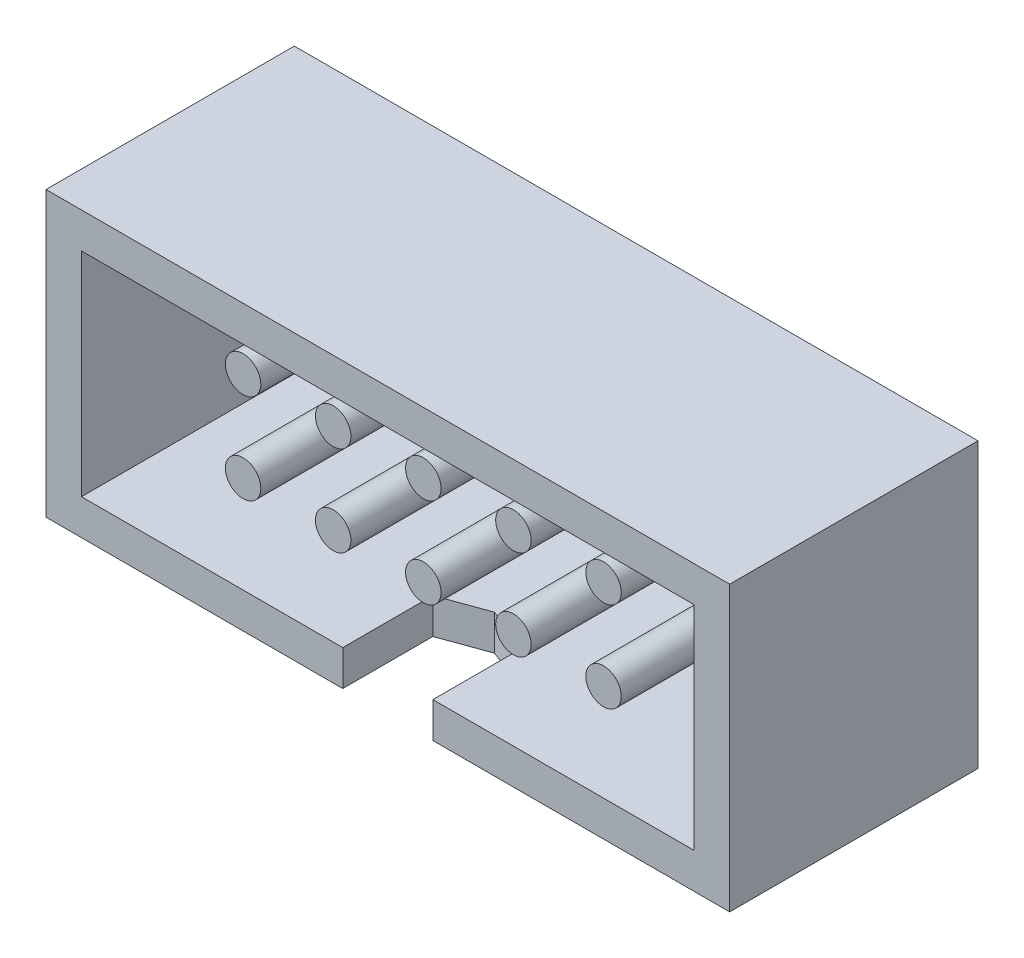
ISO-10303-21;
HEADER;
FILE_DESCRIPTION(('STEP AP214'),'2;1');
FILE_NAME('part.step','',(''),(''),'','','');
FILE_SCHEMA(('AUTOMOTIVE_DESIGN { 1 0 10303 214 1 1 1 1 }'));
ENDSEC;
DATA;
#1=APPLICATION_CONTEXT('core data for automotive mechanical design processes');
#2=APPLICATION_PROTOCOL_DEFINITION('international standard','automotive_design',2000,#1);
#3=PRODUCT_CONTEXT('',#1,'mechanical');
#4=PRODUCT('Part','Part','',(#3));
#5=PRODUCT_RELATED_PRODUCT_CATEGORY('part','',(#4));
#6=PRODUCT_DEFINITION_FORMATION('','',#4);
#7=PRODUCT_DEFINITION_CONTEXT('part definition',#1,'design');
#8=PRODUCT_DEFINITION('design','',#6,#7);
#9=PRODUCT_DEFINITION_SHAPE('','',#8);
#10=(LENGTH_UNIT() NAMED_UNIT(*) SI_UNIT(.MILLI.,.METRE.));
#11=(NAMED_UNIT(*) PLANE_ANGLE_UNIT() SI_UNIT($,.RADIAN.));
#12=(NAMED_UNIT(*) SI_UNIT($,.STERADIAN.) SOLID_ANGLE_UNIT());
#13=UNCERTAINTY_MEASURE_WITH_UNIT(LENGTH_MEASURE(1.E-05),#10,'distance_accuracy_value','');
#14=(GEOMETRIC_REPRESENTATION_CONTEXT(3) GLOBAL_UNCERTAINTY_ASSIGNED_CONTEXT((#13)) GLOBAL_UNIT_ASSIGNED_CONTEXT((#10,
#11,#12)) REPRESENTATION_CONTEXT('',''));
#15=CARTESIAN_POINT('',(0.,0.,0.));
#16=DIRECTION('',(0.,0.,1.));
#17=DIRECTION('',(1.,0.,0.));
#18=AXIS2_PLACEMENT_3D('',#15,#16,#17);
#19=CARTESIAN_POINT('',(0.,0.,7.));
#20=DIRECTION('',(1.,0.,0.));
#21=DIRECTION('',(0.,1.,0.));
#22=AXIS2_PLACEMENT_3D('',#19,#20,#21);
#23=PLANE('',#22);
#24=DIRECTION('',(0.,-1.,0.));
#25=VECTOR('',#24,1.);
#26=CARTESIAN_POINT('',(0.,0.,0.));
#27=LINE('',#26,#25);
#28=CARTESIAN_POINT('',(0.,0.,0.));
#29=VERTEX_POINT('',#28);
#30=CARTESIAN_POINT('',(0.,-8.,0.));
#31=VERTEX_POINT('',#30);
#32=EDGE_CURVE('E171',#29,#31,#27,.T.);
#33=ORIENTED_EDGE('',*,*,#32,.T.);
#34=DIRECTION('',(0.,0.,-1.));
#35=VECTOR('',#34,1.);
#36=CARTESIAN_POINT('',(0.,-8.,7.));
#37=LINE('',#36,#35);
#38=CARTESIAN_POINT('',(0.,-8.,7.));
#39=VERTEX_POINT('',#38);
#40=EDGE_CURVE('E11',#39,#31,#37,.T.);
#41=ORIENTED_EDGE('',*,*,#40,.F.);
#42=DIRECTION('',(0.,-1.,0.));
#43=VECTOR('',#42,1.);
#44=CARTESIAN_POINT('',(0.,0.,7.));
#45=LINE('',#44,#43);
#46=CARTESIAN_POINT('',(0.,0.,7.));
#47=VERTEX_POINT('',#46);
#48=EDGE_CURVE('E178',#47,#39,#45,.T.);
#49=ORIENTED_EDGE('',*,*,#48,.F.);
#50=DIRECTION('',(0.,0.,-1.));
#51=VECTOR('',#50,1.);
#52=CARTESIAN_POINT('',(0.,0.,7.));
#53=LINE('',#52,#51);
#54=EDGE_CURVE('E187',#47,#29,#53,.T.);
#55=ORIENTED_EDGE('',*,*,#54,.T.);
#56=EDGE_LOOP('',(#33,#41,#49,#55));
#57=FACE_BOUND('',#56,.T.);
#58=ADVANCED_FACE('F34',(#57),#23,.F.);
#59=CARTESIAN_POINT('',(0.,-8.,7.));
#60=DIRECTION('',(0.,1.,0.));
#61=DIRECTION('',(0.,0.,1.));
#62=AXIS2_PLACEMENT_3D('',#59,#60,#61);
#63=PLANE('',#62);
#64=DIRECTION('',(1.,0.,0.));
#65=VECTOR('',#64,1.);
#66=CARTESIAN_POINT('',(0.,-8.,7.));
#67=LINE('',#66,#65);
#68=CARTESIAN_POINT('',(10.905,-8.,7.));
#69=VERTEX_POINT('',#68);
#70=CARTESIAN_POINT('',(19.27,-8.,7.));
#71=VERTEX_POINT('',#70);
#72=EDGE_CURVE('E180',#69,#71,#67,.T.);
#73=ORIENTED_EDGE('',*,*,#72,.F.);
#74=DIRECTION('',(0.,0.,1.));
#75=VECTOR('',#74,1.);
#76=CARTESIAN_POINT('',(10.905,-8.,7.));
#77=LINE('',#76,#75);
#78=CARTESIAN_POINT('',(10.905,-8.,4.46));
#79=VERTEX_POINT('',#78);
#80=EDGE_CURVE('E149',#79,#69,#77,.T.);
#81=ORIENTED_EDGE('',*,*,#80,.F.);
#82=DIRECTION('',(0.940224983716919,0.,0.340553931110065));
#83=VECTOR('',#82,1.);
#84=CARTESIAN_POINT('',(9.635,-8.,4.));
#85=LINE('',#84,#83);
#86=CARTESIAN_POINT('',(9.635,-8.,4.));
#87=VERTEX_POINT('',#86);
#88=EDGE_CURVE('E327',#87,#79,#85,.T.);
#89=ORIENTED_EDGE('',*,*,#88,.F.);
#90=DIRECTION('',(0.940224983716919,0.,-0.340553931110065));
#91=VECTOR('',#90,1.);
#92=CARTESIAN_POINT('',(8.365,-8.,4.46));
#93=LINE('',#92,#91);
#94=CARTESIAN_POINT('',(8.365,-8.,4.46));
#95=VERTEX_POINT('',#94);
#96=EDGE_CURVE('E324',#95,#87,#93,.T.);
#97=ORIENTED_EDGE('',*,*,#96,.F.);
#98=DIRECTION('',(0.,0.,-1.));
#99=VECTOR('',#98,1.);
#100=CARTESIAN_POINT('',(8.365,-8.,7.));
#101=LINE('',#100,#99);
#102=CARTESIAN_POINT('',(8.365,-8.,7.));
#103=VERTEX_POINT('',#102);
#104=EDGE_CURVE('E322',#103,#95,#101,.T.);
#105=ORIENTED_EDGE('',*,*,#104,.F.);
#106=EDGE_CURVE('E148',#39,#103,#67,.T.);
#107=ORIENTED_EDGE('',*,*,#106,.F.);
#108=ORIENTED_EDGE('',*,*,#40,.T.);
#109=DIRECTION('',(1.,0.,0.));
#110=VECTOR('',#109,1.);
#111=CARTESIAN_POINT('',(0.,-8.,0.));
#112=LINE('',#111,#110);
#113=CARTESIAN_POINT('',(19.27,-8.,0.));
#114=VERTEX_POINT('',#113);
#115=EDGE_CURVE('E190',#31,#114,#112,.T.);
#116=ORIENTED_EDGE('',*,*,#115,.T.);
#117=DIRECTION('',(0.,0.,-1.));
#118=VECTOR('',#117,1.);
#119=CARTESIAN_POINT('',(19.27,-8.,7.));
#120=LINE('',#119,#118);
#121=EDGE_CURVE('E42',#71,#114,#120,.T.);
#122=ORIENTED_EDGE('',*,*,#121,.F.);
#123=EDGE_LOOP('',(#73,#81,#89,#97,#105,#107,#108,#116,#122));
#124=FACE_BOUND('',#123,.T.);
#125=ADVANCED_FACE('F362',(#124),#63,.F.);
#126=CARTESIAN_POINT('',(19.27,0.,7.));
#127=DIRECTION('',(-1.,0.,0.));
#128=DIRECTION('',(0.,-1.,0.));
#129=AXIS2_PLACEMENT_3D('',#126,#127,#128);
#130=PLANE('',#129);
#131=DIRECTION('',(0.,1.,0.));
#132=VECTOR('',#131,1.);
#133=CARTESIAN_POINT('',(19.27,0.,0.));
#134=LINE('',#133,#132);
#135=CARTESIAN_POINT('',(19.27,0.,0.));
#136=VERTEX_POINT('',#135);
#137=EDGE_CURVE('E192',#114,#136,#134,.T.);
#138=ORIENTED_EDGE('',*,*,#137,.T.);
#139=DIRECTION('',(0.,0.,-1.));
#140=VECTOR('',#139,1.);
#141=CARTESIAN_POINT('',(19.27,0.,7.));
#142=LINE('',#141,#140);
#143=CARTESIAN_POINT('',(19.27,0.,7.));
#144=VERTEX_POINT('',#143);
#145=EDGE_CURVE('E197',#144,#136,#142,.T.);
#146=ORIENTED_EDGE('',*,*,#145,.F.);
#147=DIRECTION('',(0.,1.,0.));
#148=VECTOR('',#147,1.);
#149=CARTESIAN_POINT('',(19.27,0.,7.));
#150=LINE('',#149,#148);
#151=EDGE_CURVE('E183',#71,#144,#150,.T.);
#152=ORIENTED_EDGE('',*,*,#151,.F.);
#153=ORIENTED_EDGE('',*,*,#121,.T.);
#154=EDGE_LOOP('',(#138,#146,#152,#153));
#155=FACE_BOUND('',#154,.T.);
#156=ADVANCED_FACE('F368',(#155),#130,.F.);
#157=CARTESIAN_POINT('',(0.,0.,7.));
#158=DIRECTION('',(0.,-1.,0.));
#159=DIRECTION('',(0.,0.,-1.));
#160=AXIS2_PLACEMENT_3D('',#157,#158,#159);
#161=PLANE('',#160);
#162=DIRECTION('',(-1.,0.,0.));
#163=VECTOR('',#162,1.);
#164=CARTESIAN_POINT('',(0.,0.,0.));
#165=LINE('',#164,#163);
#166=EDGE_CURVE('E181',#136,#29,#165,.T.);
#167=ORIENTED_EDGE('',*,*,#166,.T.);
#168=ORIENTED_EDGE('',*,*,#54,.F.);
#169=DIRECTION('',(-1.,0.,0.));
#170=VECTOR('',#169,1.);
#171=CARTESIAN_POINT('',(0.,0.,7.));
#172=LINE('',#171,#170);
#173=EDGE_CURVE('E185',#144,#47,#172,.T.);
#174=ORIENTED_EDGE('',*,*,#173,.F.);
#175=ORIENTED_EDGE('',*,*,#145,.T.);
#176=EDGE_LOOP('',(#167,#168,#174,#175));
#177=FACE_BOUND('',#176,.T.);
#178=ADVANCED_FACE('F374',(#177),#161,.F.);
#179=CARTESIAN_POINT('',(0.,-8.,7.));
#180=DIRECTION('',(0.,0.,1.));
#181=DIRECTION('',(1.,0.,0.));
#182=AXIS2_PLACEMENT_3D('',#179,#180,#181);
#183=PLANE('',#182);
#184=DIRECTION('',(0.,-1.,0.));
#185=VECTOR('',#184,1.);
#186=CARTESIAN_POINT('',(10.905,0.000999999999999265,7.));
#187=LINE('',#186,#185);
#188=CARTESIAN_POINT('',(10.905,-7.,7.));
#189=VERTEX_POINT('',#188);
#190=EDGE_CURVE('E138',#189,#69,#187,.T.);
#191=ORIENTED_EDGE('',*,*,#190,.T.);
#192=ORIENTED_EDGE('',*,*,#72,.T.);
#193=ORIENTED_EDGE('',*,*,#151,.T.);
#194=ORIENTED_EDGE('',*,*,#173,.T.);
#195=ORIENTED_EDGE('',*,*,#48,.T.);
#196=ORIENTED_EDGE('',*,*,#106,.T.);
#197=DIRECTION('',(0.,-1.,0.));
#198=VECTOR('',#197,1.);
#199=CARTESIAN_POINT('',(8.365,0.000999999999999265,7.));
#200=LINE('',#199,#198);
#201=CARTESIAN_POINT('',(8.365,-7.,7.));
#202=VERTEX_POINT('',#201);
#203=EDGE_CURVE('E134',#202,#103,#200,.T.);
#204=ORIENTED_EDGE('',*,*,#203,.F.);
#205=DIRECTION('',(1.,0.,0.));
#206=VECTOR('',#205,1.);
#207=CARTESIAN_POINT('',(1.,-7.,7.));
#208=LINE('',#207,#206);
#209=CARTESIAN_POINT('',(1.,-7.,7.));
#210=VERTEX_POINT('',#209);
#211=EDGE_CURVE('E146',#210,#202,#208,.T.);
#212=ORIENTED_EDGE('',*,*,#211,.F.);
#213=DIRECTION('',(0.,-1.,0.));
#214=VECTOR('',#213,1.);
#215=CARTESIAN_POINT('',(1.,-1.,7.));
#216=LINE('',#215,#214);
#217=CARTESIAN_POINT('',(1.,-1.,7.));
#218=VERTEX_POINT('',#217);
#219=EDGE_CURVE('E167',#218,#210,#216,.T.);
#220=ORIENTED_EDGE('',*,*,#219,.F.);
#221=DIRECTION('',(-1.,0.,0.));
#222=VECTOR('',#221,1.);
#223=CARTESIAN_POINT('',(1.,-1.,7.));
#224=LINE('',#223,#222);
#225=CARTESIAN_POINT('',(18.27,-1.,7.));
#226=VERTEX_POINT('',#225);
#227=EDGE_CURVE('E159',#226,#218,#224,.T.);
#228=ORIENTED_EDGE('',*,*,#227,.F.);
#229=DIRECTION('',(0.,1.,0.));
#230=VECTOR('',#229,1.);
#231=CARTESIAN_POINT('',(18.27,-1.,7.));
#232=LINE('',#231,#230);
#233=CARTESIAN_POINT('',(18.27,-7.,7.));
#234=VERTEX_POINT('',#233);
#235=EDGE_CURVE('E156',#234,#226,#232,.T.);
#236=ORIENTED_EDGE('',*,*,#235,.F.);
#237=EDGE_CURVE('E58',#189,#234,#208,.T.);
#238=ORIENTED_EDGE('',*,*,#237,.F.);
#239=EDGE_LOOP('',(#191,#192,#193,#194,#195,#196,#204,#212,#220,#228,#236,#238));
#240=FACE_BOUND('',#239,.T.);
#241=ADVANCED_FACE('F144',(#240),#183,.T.);
#242=CARTESIAN_POINT('',(0.,-8.,0.));
#243=DIRECTION('',(0.,0.,1.));
#244=DIRECTION('',(1.,0.,0.));
#245=AXIS2_PLACEMENT_3D('',#242,#243,#244);
#246=PLANE('',#245);
#247=CARTESIAN_POINT('',(4.555,-5.27,0.));
#248=DIRECTION('',(0.,0.,1.));
#249=DIRECTION('',(1.,0.,0.));
#250=AXIS2_PLACEMENT_3D('',#247,#248,#249);
#251=CIRCLE('',#250,0.500000000000002);
#252=CARTESIAN_POINT('',(5.055,-5.27,0.));
#253=VERTEX_POINT('',#252);
#254=EDGE_CURVE('E256',#253,#253,#251,.T.);
#255=ORIENTED_EDGE('',*,*,#254,.T.);
#256=EDGE_LOOP('',(#255));
#257=FACE_BOUND('',#256,.T.);
#258=CARTESIAN_POINT('',(7.095,-5.27,0.));
#259=DIRECTION('',(0.,0.,1.));
#260=DIRECTION('',(1.,0.,0.));
#261=AXIS2_PLACEMENT_3D('',#258,#259,#260);
#262=CIRCLE('',#261,0.500000000000001);
#263=CARTESIAN_POINT('',(7.595,-5.27,0.));
#264=VERTEX_POINT('',#263);
#265=EDGE_CURVE('E243',#264,#264,#262,.T.);
#266=ORIENTED_EDGE('',*,*,#265,.T.);
#267=EDGE_LOOP('',(#266));
#268=FACE_BOUND('',#267,.T.);
#269=CARTESIAN_POINT('',(9.635,-5.27,0.));
#270=DIRECTION('',(0.,0.,1.));
#271=DIRECTION('',(1.,0.,0.));
#272=AXIS2_PLACEMENT_3D('',#269,#270,#271);
#273=CIRCLE('',#272,0.500000000000001);
#274=CARTESIAN_POINT('',(10.135,-5.27,0.));
#275=VERTEX_POINT('',#274);
#276=EDGE_CURVE('E239',#275,#275,#273,.T.);
#277=ORIENTED_EDGE('',*,*,#276,.T.);
#278=EDGE_LOOP('',(#277));
#279=FACE_BOUND('',#278,.T.);
#280=CARTESIAN_POINT('',(12.175,-5.27,0.));
#281=DIRECTION('',(0.,0.,1.));
#282=DIRECTION('',(1.,0.,0.));
#283=AXIS2_PLACEMENT_3D('',#280,#281,#282);
#284=CIRCLE('',#283,0.500000000000001);
#285=CARTESIAN_POINT('',(12.675,-5.27,0.));
#286=VERTEX_POINT('',#285);
#287=EDGE_CURVE('E235',#286,#286,#284,.T.);
#288=ORIENTED_EDGE('',*,*,#287,.T.);
#289=EDGE_LOOP('',(#288));
#290=FACE_BOUND('',#289,.T.);
#291=CARTESIAN_POINT('',(14.715,-5.27,0.));
#292=DIRECTION('',(0.,0.,1.));
#293=DIRECTION('',(1.,0.,0.));
#294=AXIS2_PLACEMENT_3D('',#291,#292,#293);
#295=CIRCLE('',#294,0.500000000000003);
#296=CARTESIAN_POINT('',(15.215,-5.27,0.));
#297=VERTEX_POINT('',#296);
#298=EDGE_CURVE('E230',#297,#297,#295,.T.);
#299=ORIENTED_EDGE('',*,*,#298,.T.);
#300=EDGE_LOOP('',(#299));
#301=FACE_BOUND('',#300,.T.);
#302=CARTESIAN_POINT('',(7.095,-2.73,0.));
#303=DIRECTION('',(0.,0.,1.));
#304=DIRECTION('',(1.,0.,0.));
#305=AXIS2_PLACEMENT_3D('',#302,#303,#304);
#306=CIRCLE('',#305,0.500000000000001);
#307=CARTESIAN_POINT('',(7.595,-2.73,0.));
#308=VERTEX_POINT('',#307);
#309=EDGE_CURVE('E225',#308,#308,#306,.T.);
#310=ORIENTED_EDGE('',*,*,#309,.T.);
#311=EDGE_LOOP('',(#310));
#312=FACE_BOUND('',#311,.T.);
#313=CARTESIAN_POINT('',(4.555,-2.73,0.));
#314=DIRECTION('',(0.,0.,1.));
#315=DIRECTION('',(1.,0.,0.));
#316=AXIS2_PLACEMENT_3D('',#313,#314,#315);
#317=CIRCLE('',#316,0.500000000000002);
#318=CARTESIAN_POINT('',(5.055,-2.73,0.));
#319=VERTEX_POINT('',#318);
#320=EDGE_CURVE('E220',#319,#319,#317,.T.);
#321=ORIENTED_EDGE('',*,*,#320,.T.);
#322=EDGE_LOOP('',(#321));
#323=FACE_BOUND('',#322,.T.);
#324=CARTESIAN_POINT('',(14.715,-2.73,0.));
#325=DIRECTION('',(0.,0.,1.));
#326=DIRECTION('',(1.,0.,0.));
#327=AXIS2_PLACEMENT_3D('',#324,#325,#326);
#328=CIRCLE('',#327,0.500000000000002);
#329=CARTESIAN_POINT('',(15.215,-2.73,0.));
#330=VERTEX_POINT('',#329);
#331=EDGE_CURVE('E215',#330,#330,#328,.T.);
#332=ORIENTED_EDGE('',*,*,#331,.T.);
#333=EDGE_LOOP('',(#332));
#334=FACE_BOUND('',#333,.T.);
#335=CARTESIAN_POINT('',(12.175,-2.73,0.));
#336=DIRECTION('',(0.,0.,1.));
#337=DIRECTION('',(1.,0.,0.));
#338=AXIS2_PLACEMENT_3D('',#335,#336,#337);
#339=CIRCLE('',#338,0.500000000000001);
#340=CARTESIAN_POINT('',(12.675,-2.73,0.));
#341=VERTEX_POINT('',#340);
#342=EDGE_CURVE('E210',#341,#341,#339,.T.);
#343=ORIENTED_EDGE('',*,*,#342,.T.);
#344=EDGE_LOOP('',(#343));
#345=FACE_BOUND('',#344,.T.);
#346=CARTESIAN_POINT('',(9.635,-2.73,0.));
#347=DIRECTION('',(0.,0.,1.));
#348=DIRECTION('',(1.,0.,0.));
#349=AXIS2_PLACEMENT_3D('',#346,#347,#348);
#350=CIRCLE('',#349,0.500000000000001);
#351=CARTESIAN_POINT('',(10.135,-2.73,0.));
#352=VERTEX_POINT('',#351);
#353=EDGE_CURVE('E205',#352,#352,#350,.T.);
#354=ORIENTED_EDGE('',*,*,#353,.T.);
#355=EDGE_LOOP('',(#354));
#356=FACE_BOUND('',#355,.T.);
#357=ORIENTED_EDGE('',*,*,#32,.F.);
#358=ORIENTED_EDGE('',*,*,#166,.F.);
#359=ORIENTED_EDGE('',*,*,#137,.F.);
#360=ORIENTED_EDGE('',*,*,#115,.F.);
#361=EDGE_LOOP('',(#357,#358,#359,#360));
#362=FACE_BOUND('',#361,.T.);
#363=ADVANCED_FACE('F404',(#257,#268,#279,#290,#301,#312,#323,#334,#345,#356,#362),#246,.F.);
#364=CARTESIAN_POINT('',(1.,-7.,1.));
#365=DIRECTION('',(0.,-1.,0.));
#366=DIRECTION('',(1.,0.,0.));
#367=AXIS2_PLACEMENT_3D('',#364,#365,#366);
#368=PLANE('',#367);
#369=DIRECTION('',(-0.940224983716919,0.,-0.340553931110065));
#370=VECTOR('',#369,1.);
#371=CARTESIAN_POINT('',(9.635,-7.,4.));
#372=LINE('',#371,#370);
#373=CARTESIAN_POINT('',(10.905,-7.,4.46));
#374=VERTEX_POINT('',#373);
#375=CARTESIAN_POINT('',(9.635,-7.,4.));
#376=VERTEX_POINT('',#375);
#377=EDGE_CURVE('E316',#374,#376,#372,.T.);
#378=ORIENTED_EDGE('',*,*,#377,.F.);
#379=DIRECTION('',(0.,0.,-1.));
#380=VECTOR('',#379,1.);
#381=CARTESIAN_POINT('',(10.905,-7.,7.));
#382=LINE('',#381,#380);
#383=EDGE_CURVE('E319',#189,#374,#382,.T.);
#384=ORIENTED_EDGE('',*,*,#383,.F.);
#385=ORIENTED_EDGE('',*,*,#237,.T.);
#386=DIRECTION('',(0.,0.,1.));
#387=VECTOR('',#386,1.);
#388=CARTESIAN_POINT('',(18.27,-7.,1.));
#389=LINE('',#388,#387);
#390=CARTESIAN_POINT('',(18.27,-7.,1.));
#391=VERTEX_POINT('',#390);
#392=EDGE_CURVE('E176',#391,#234,#389,.T.);
#393=ORIENTED_EDGE('',*,*,#392,.F.);
#394=DIRECTION('',(1.,0.,0.));
#395=VECTOR('',#394,1.);
#396=CARTESIAN_POINT('',(1.,-7.,1.));
#397=LINE('',#396,#395);
#398=CARTESIAN_POINT('',(1.,-7.,1.));
#399=VERTEX_POINT('',#398);
#400=EDGE_CURVE('E169',#399,#391,#397,.T.);
#401=ORIENTED_EDGE('',*,*,#400,.F.);
#402=DIRECTION('',(0.,0.,1.));
#403=VECTOR('',#402,1.);
#404=CARTESIAN_POINT('',(1.,-7.,1.));
#405=LINE('',#404,#403);
#406=EDGE_CURVE('E154',#399,#210,#405,.T.);
#407=ORIENTED_EDGE('',*,*,#406,.T.);
#408=ORIENTED_EDGE('',*,*,#211,.T.);
#409=DIRECTION('',(0.,0.,1.));
#410=VECTOR('',#409,1.);
#411=CARTESIAN_POINT('',(8.365,-7.,7.));
#412=LINE('',#411,#410);
#413=CARTESIAN_POINT('',(8.365,-7.,4.46));
#414=VERTEX_POINT('',#413);
#415=EDGE_CURVE('E130',#414,#202,#412,.T.);
#416=ORIENTED_EDGE('',*,*,#415,.F.);
#417=DIRECTION('',(-0.940224983716919,0.,0.340553931110065));
#418=VECTOR('',#417,1.);
#419=CARTESIAN_POINT('',(8.365,-7.,4.46));
#420=LINE('',#419,#418);
#421=EDGE_CURVE('E50',#376,#414,#420,.T.);
#422=ORIENTED_EDGE('',*,*,#421,.F.);
#423=EDGE_LOOP('',(#378,#384,#385,#393,#401,#407,#408,#416,#422));
#424=FACE_BOUND('',#423,.T.);
#425=ADVANCED_FACE('F152',(#424),#368,.F.);
#426=CARTESIAN_POINT('',(1.,-1.,1.));
#427=DIRECTION('',(-1.,0.,0.));
#428=DIRECTION('',(0.,-1.,0.));
#429=AXIS2_PLACEMENT_3D('',#426,#427,#428);
#430=PLANE('',#429);
#431=ORIENTED_EDGE('',*,*,#219,.T.);
#432=ORIENTED_EDGE('',*,*,#406,.F.);
#433=DIRECTION('',(0.,-1.,0.));
#434=VECTOR('',#433,1.);
#435=CARTESIAN_POINT('',(1.,-1.,1.));
#436=LINE('',#435,#434);
#437=CARTESIAN_POINT('',(1.,-1.,1.));
#438=VERTEX_POINT('',#437);
#439=EDGE_CURVE('E162',#438,#399,#436,.T.);
#440=ORIENTED_EDGE('',*,*,#439,.F.);
#441=DIRECTION('',(0.,0.,1.));
#442=VECTOR('',#441,1.);
#443=CARTESIAN_POINT('',(1.,-1.,1.));
#444=LINE('',#443,#442);
#445=EDGE_CURVE('E172',#438,#218,#444,.T.);
#446=ORIENTED_EDGE('',*,*,#445,.T.);
#447=EDGE_LOOP('',(#431,#432,#440,#446));
#448=FACE_BOUND('',#447,.T.);
#449=ADVANCED_FACE('F349',(#448),#430,.F.);
#450=CARTESIAN_POINT('',(1.,-1.,1.));
#451=DIRECTION('',(0.,1.,0.));
#452=DIRECTION('',(0.,0.,1.));
#453=AXIS2_PLACEMENT_3D('',#450,#451,#452);
#454=PLANE('',#453);
#455=ORIENTED_EDGE('',*,*,#227,.T.);
#456=ORIENTED_EDGE('',*,*,#445,.F.);
#457=DIRECTION('',(-1.,0.,0.));
#458=VECTOR('',#457,1.);
#459=CARTESIAN_POINT('',(1.,-1.,1.));
#460=LINE('',#459,#458);
#461=CARTESIAN_POINT('',(18.27,-1.,1.));
#462=VERTEX_POINT('',#461);
#463=EDGE_CURVE('E341',#462,#438,#460,.T.);
#464=ORIENTED_EDGE('',*,*,#463,.F.);
#465=DIRECTION('',(0.,0.,1.));
#466=VECTOR('',#465,1.);
#467=CARTESIAN_POINT('',(18.27,-1.,1.));
#468=LINE('',#467,#466);
#469=EDGE_CURVE('E174',#462,#226,#468,.T.);
#470=ORIENTED_EDGE('',*,*,#469,.T.);
#471=EDGE_LOOP('',(#455,#456,#464,#470));
#472=FACE_BOUND('',#471,.T.);
#473=ADVANCED_FACE('F356',(#472),#454,.F.);
#474=CARTESIAN_POINT('',(18.27,-1.,1.));
#475=DIRECTION('',(1.,0.,0.));
#476=DIRECTION('',(0.,1.,0.));
#477=AXIS2_PLACEMENT_3D('',#474,#475,#476);
#478=PLANE('',#477);
#479=ORIENTED_EDGE('',*,*,#235,.T.);
#480=ORIENTED_EDGE('',*,*,#469,.F.);
#481=DIRECTION('',(0.,1.,0.));
#482=VECTOR('',#481,1.);
#483=CARTESIAN_POINT('',(18.27,-1.,1.));
#484=LINE('',#483,#482);
#485=EDGE_CURVE('E339',#391,#462,#484,.T.);
#486=ORIENTED_EDGE('',*,*,#485,.F.);
#487=ORIENTED_EDGE('',*,*,#392,.T.);
#488=EDGE_LOOP('',(#479,#480,#486,#487));
#489=FACE_BOUND('',#488,.T.);
#490=ADVANCED_FACE('F353',(#489),#478,.F.);
#491=CARTESIAN_POINT('',(18.27,-7.,1.));
#492=DIRECTION('',(0.,0.,-1.));
#493=DIRECTION('',(-1.,0.,0.));
#494=AXIS2_PLACEMENT_3D('',#491,#492,#493);
#495=PLANE('',#494);
#496=CARTESIAN_POINT('',(4.555,-5.27,1.));
#497=DIRECTION('',(0.,0.,-1.));
#498=DIRECTION('',(-1.,0.,0.));
#499=AXIS2_PLACEMENT_3D('',#496,#497,#498);
#500=CIRCLE('',#499,0.500000000000002);
#501=CARTESIAN_POINT('',(4.055,-5.27,1.));
#502=VERTEX_POINT('',#501);
#503=EDGE_CURVE('E37',#502,#502,#500,.T.);
#504=ORIENTED_EDGE('',*,*,#503,.T.);
#505=EDGE_LOOP('',(#504));
#506=FACE_BOUND('',#505,.T.);
#507=CARTESIAN_POINT('',(7.095,-5.27,1.));
#508=DIRECTION('',(0.,0.,-1.));
#509=DIRECTION('',(-1.,0.,0.));
#510=AXIS2_PLACEMENT_3D('',#507,#508,#509);
#511=CIRCLE('',#510,0.500000000000001);
#512=CARTESIAN_POINT('',(6.595,-5.27,1.));
#513=VERTEX_POINT('',#512);
#514=EDGE_CURVE('E241',#513,#513,#511,.T.);
#515=ORIENTED_EDGE('',*,*,#514,.T.);
#516=EDGE_LOOP('',(#515));
#517=FACE_BOUND('',#516,.T.);
#518=CARTESIAN_POINT('',(9.635,-5.27,1.));
#519=DIRECTION('',(0.,0.,-1.));
#520=DIRECTION('',(-1.,0.,0.));
#521=AXIS2_PLACEMENT_3D('',#518,#519,#520);
#522=CIRCLE('',#521,0.500000000000001);
#523=CARTESIAN_POINT('',(9.135,-5.27,1.));
#524=VERTEX_POINT('',#523);
#525=EDGE_CURVE('E237',#524,#524,#522,.T.);
#526=ORIENTED_EDGE('',*,*,#525,.T.);
#527=EDGE_LOOP('',(#526));
#528=FACE_BOUND('',#527,.T.);
#529=CARTESIAN_POINT('',(12.175,-5.27,1.));
#530=DIRECTION('',(0.,0.,-1.));
#531=DIRECTION('',(-1.,0.,0.));
#532=AXIS2_PLACEMENT_3D('',#529,#530,#531);
#533=CIRCLE('',#532,0.500000000000001);
#534=CARTESIAN_POINT('',(11.675,-5.27,1.));
#535=VERTEX_POINT('',#534);
#536=EDGE_CURVE('E232',#535,#535,#533,.T.);
#537=ORIENTED_EDGE('',*,*,#536,.T.);
#538=EDGE_LOOP('',(#537));
#539=FACE_BOUND('',#538,.T.);
#540=CARTESIAN_POINT('',(14.715,-5.27,1.));
#541=DIRECTION('',(0.,0.,-1.));
#542=DIRECTION('',(-1.,0.,0.));
#543=AXIS2_PLACEMENT_3D('',#540,#541,#542);
#544=CIRCLE('',#543,0.500000000000003);
#545=CARTESIAN_POINT('',(14.215,-5.27,1.));
#546=VERTEX_POINT('',#545);
#547=EDGE_CURVE('E227',#546,#546,#544,.T.);
#548=ORIENTED_EDGE('',*,*,#547,.T.);
#549=EDGE_LOOP('',(#548));
#550=FACE_BOUND('',#549,.T.);
#551=CARTESIAN_POINT('',(7.095,-2.73,1.));
#552=DIRECTION('',(0.,0.,-1.));
#553=DIRECTION('',(-1.,0.,0.));
#554=AXIS2_PLACEMENT_3D('',#551,#552,#553);
#555=CIRCLE('',#554,0.500000000000001);
#556=CARTESIAN_POINT('',(6.595,-2.73,1.));
#557=VERTEX_POINT('',#556);
#558=EDGE_CURVE('E222',#557,#557,#555,.T.);
#559=ORIENTED_EDGE('',*,*,#558,.T.);
#560=EDGE_LOOP('',(#559));
#561=FACE_BOUND('',#560,.T.);
#562=CARTESIAN_POINT('',(4.555,-2.73,1.));
#563=DIRECTION('',(0.,0.,-1.));
#564=DIRECTION('',(-1.,0.,0.));
#565=AXIS2_PLACEMENT_3D('',#562,#563,#564);
#566=CIRCLE('',#565,0.500000000000002);
#567=CARTESIAN_POINT('',(4.055,-2.73,1.));
#568=VERTEX_POINT('',#567);
#569=EDGE_CURVE('E217',#568,#568,#566,.T.);
#570=ORIENTED_EDGE('',*,*,#569,.T.);
#571=EDGE_LOOP('',(#570));
#572=FACE_BOUND('',#571,.T.);
#573=CARTESIAN_POINT('',(14.715,-2.73,1.));
#574=DIRECTION('',(0.,0.,-1.));
#575=DIRECTION('',(-1.,0.,0.));
#576=AXIS2_PLACEMENT_3D('',#573,#574,#575);
#577=CIRCLE('',#576,0.500000000000002);
#578=CARTESIAN_POINT('',(14.215,-2.73,1.));
#579=VERTEX_POINT('',#578);
#580=EDGE_CURVE('E212',#579,#579,#577,.T.);
#581=ORIENTED_EDGE('',*,*,#580,.T.);
#582=EDGE_LOOP('',(#581));
#583=FACE_BOUND('',#582,.T.);
#584=CARTESIAN_POINT('',(12.175,-2.73,1.));
#585=DIRECTION('',(0.,0.,-1.));
#586=DIRECTION('',(-1.,0.,0.));
#587=AXIS2_PLACEMENT_3D('',#584,#585,#586);
#588=CIRCLE('',#587,0.500000000000001);
#589=CARTESIAN_POINT('',(11.675,-2.73,1.));
#590=VERTEX_POINT('',#589);
#591=EDGE_CURVE('E207',#590,#590,#588,.T.);
#592=ORIENTED_EDGE('',*,*,#591,.T.);
#593=EDGE_LOOP('',(#592));
#594=FACE_BOUND('',#593,.T.);
#595=CARTESIAN_POINT('',(9.635,-2.73,1.));
#596=DIRECTION('',(0.,0.,-1.));
#597=DIRECTION('',(-1.,0.,0.));
#598=AXIS2_PLACEMENT_3D('',#595,#596,#597);
#599=CIRCLE('',#598,0.500000000000001);
#600=CARTESIAN_POINT('',(9.135,-2.73,1.));
#601=VERTEX_POINT('',#600);
#602=EDGE_CURVE('E202',#601,#601,#599,.T.);
#603=ORIENTED_EDGE('',*,*,#602,.T.);
#604=EDGE_LOOP('',(#603));
#605=FACE_BOUND('',#604,.T.);
#606=ORIENTED_EDGE('',*,*,#400,.T.);
#607=ORIENTED_EDGE('',*,*,#485,.T.);
#608=ORIENTED_EDGE('',*,*,#463,.T.);
#609=ORIENTED_EDGE('',*,*,#439,.T.);
#610=EDGE_LOOP('',(#606,#607,#608,#609));
#611=FACE_BOUND('',#610,.T.);
#612=ADVANCED_FACE('F347',(#506,#517,#528,#539,#550,#561,#572,#583,#594,#605,#611),#495,.F.);
#613=CARTESIAN_POINT('',(10.905,0.000999999999999265,7.));
#614=DIRECTION('',(1.,0.,0.));
#615=DIRECTION('',(0.,0.,-1.));
#616=AXIS2_PLACEMENT_3D('',#613,#614,#615);
#617=PLANE('',#616);
#618=ORIENTED_EDGE('',*,*,#383,.T.);
#619=DIRECTION('',(0.,-1.,0.));
#620=VECTOR('',#619,1.);
#621=CARTESIAN_POINT('',(10.905,0.000999999999999265,4.46));
#622=LINE('',#621,#620);
#623=EDGE_CURVE('E332',#374,#79,#622,.T.);
#624=ORIENTED_EDGE('',*,*,#623,.T.);
#625=ORIENTED_EDGE('',*,*,#80,.T.);
#626=ORIENTED_EDGE('',*,*,#190,.F.);
#627=EDGE_LOOP('',(#618,#624,#625,#626));
#628=FACE_BOUND('',#627,.T.);
#629=ADVANCED_FACE('F382',(#628),#617,.F.);
#630=CARTESIAN_POINT('',(9.635,0.000999999999999265,4.));
#631=DIRECTION('',(0.340553931110065,0.,-0.940224983716919));
#632=DIRECTION('',(-0.940224983716919,0.,-0.340553931110065));
#633=AXIS2_PLACEMENT_3D('',#630,#631,#632);
#634=PLANE('',#633);
#635=ORIENTED_EDGE('',*,*,#377,.T.);
#636=DIRECTION('',(0.,-1.,0.));
#637=VECTOR('',#636,1.);
#638=CARTESIAN_POINT('',(9.635,0.000999999999999265,4.));
#639=LINE('',#638,#637);
#640=EDGE_CURVE('E334',#376,#87,#639,.T.);
#641=ORIENTED_EDGE('',*,*,#640,.T.);
#642=ORIENTED_EDGE('',*,*,#88,.T.);
#643=ORIENTED_EDGE('',*,*,#623,.F.);
#644=EDGE_LOOP('',(#635,#641,#642,#643));
#645=FACE_BOUND('',#644,.T.);
#646=ADVANCED_FACE('F381',(#645),#634,.F.);
#647=CARTESIAN_POINT('',(8.365,0.000999999999999265,4.46));
#648=DIRECTION('',(-0.340553931110065,0.,-0.940224983716919));
#649=DIRECTION('',(-0.940224983716919,0.,0.340553931110065));
#650=AXIS2_PLACEMENT_3D('',#647,#648,#649);
#651=PLANE('',#650);
#652=ORIENTED_EDGE('',*,*,#421,.T.);
#653=DIRECTION('',(0.,-1.,0.));
#654=VECTOR('',#653,1.);
#655=CARTESIAN_POINT('',(8.365,0.000999999999999265,4.46));
#656=LINE('',#655,#654);
#657=EDGE_CURVE('E136',#414,#95,#656,.T.);
#658=ORIENTED_EDGE('',*,*,#657,.T.);
#659=ORIENTED_EDGE('',*,*,#96,.T.);
#660=ORIENTED_EDGE('',*,*,#640,.F.);
#661=EDGE_LOOP('',(#652,#658,#659,#660));
#662=FACE_BOUND('',#661,.T.);
#663=ADVANCED_FACE('F379',(#662),#651,.F.);
#664=CARTESIAN_POINT('',(8.365,0.000999999999999265,7.));
#665=DIRECTION('',(-1.,0.,0.));
#666=DIRECTION('',(0.,0.,1.));
#667=AXIS2_PLACEMENT_3D('',#664,#665,#666);
#668=PLANE('',#667);
#669=ORIENTED_EDGE('',*,*,#415,.T.);
#670=ORIENTED_EDGE('',*,*,#203,.T.);
#671=ORIENTED_EDGE('',*,*,#104,.T.);
#672=ORIENTED_EDGE('',*,*,#657,.F.);
#673=EDGE_LOOP('',(#669,#670,#671,#672));
#674=FACE_BOUND('',#673,.T.);
#675=ADVANCED_FACE('F132',(#674),#668,.F.);
#676=CARTESIAN_POINT('',(9.635,-2.73,6.));
#677=DIRECTION('',(0.,0.,1.));
#678=DIRECTION('',(1.,0.,0.));
#679=AXIS2_PLACEMENT_3D('',#676,#677,#678);
#680=PLANE('',#679);
#681=CARTESIAN_POINT('',(9.635,-2.73,6.));
#682=DIRECTION('',(0.,0.,1.));
#683=DIRECTION('',(1.,0.,0.));
#684=AXIS2_PLACEMENT_3D('',#681,#682,#683);
#685=CIRCLE('',#684,0.500000000000001);
#686=CARTESIAN_POINT('',(10.135,-2.73,6.));
#687=VERTEX_POINT('',#686);
#688=EDGE_CURVE('E308',#687,#687,#685,.T.);
#689=ORIENTED_EDGE('',*,*,#688,.T.);
#690=EDGE_LOOP('',(#689));
#691=FACE_BOUND('',#690,.T.);
#692=ADVANCED_FACE('F420',(#691),#680,.T.);
#693=CARTESIAN_POINT('',(9.635,-2.73,-2.));
#694=DIRECTION('',(0.,0.,1.));
#695=DIRECTION('',(1.,0.,0.));
#696=AXIS2_PLACEMENT_3D('',#693,#694,#695);
#697=CYLINDRICAL_SURFACE('',#696,0.500000000000001);
#698=ORIENTED_EDGE('',*,*,#688,.F.);
#699=EDGE_LOOP('',(#698));
#700=FACE_BOUND('',#699,.T.);
#701=ORIENTED_EDGE('',*,*,#602,.F.);
#702=EDGE_LOOP('',(#701));
#703=FACE_BOUND('',#702,.T.);
#704=ADVANCED_FACE('F437',(#700,#703),#697,.T.);
#705=CARTESIAN_POINT('',(9.635,-2.73,-2.));
#706=DIRECTION('',(0.,0.,1.));
#707=DIRECTION('',(1.,0.,0.));
#708=AXIS2_PLACEMENT_3D('',#705,#706,#707);
#709=CIRCLE('',#708,0.500000000000001);
#710=CARTESIAN_POINT('',(10.135,-2.73,-2.));
#711=VERTEX_POINT('',#710);
#712=EDGE_CURVE('E206',#711,#711,#709,.T.);
#713=ORIENTED_EDGE('',*,*,#712,.T.);
#714=EDGE_LOOP('',(#713));
#715=FACE_BOUND('',#714,.T.);
#716=ORIENTED_EDGE('',*,*,#353,.F.);
#717=EDGE_LOOP('',(#716));
#718=FACE_BOUND('',#717,.T.);
#719=ADVANCED_FACE('F446',(#715,#718),#697,.T.);
#720=CARTESIAN_POINT('',(9.635,-2.73,-2.));
#721=DIRECTION('',(0.,0.,1.));
#722=DIRECTION('',(1.,0.,0.));
#723=AXIS2_PLACEMENT_3D('',#720,#721,#722);
#724=PLANE('',#723);
#725=ORIENTED_EDGE('',*,*,#712,.F.);
#726=EDGE_LOOP('',(#725));
#727=FACE_BOUND('',#726,.T.);
#728=ADVANCED_FACE('F453',(#727),#724,.F.);
#729=CARTESIAN_POINT('',(12.175,-2.73,6.));
#730=DIRECTION('',(0.,0.,1.));
#731=DIRECTION('',(1.,0.,0.));
#732=AXIS2_PLACEMENT_3D('',#729,#730,#731);
#733=PLANE('',#732);
#734=CARTESIAN_POINT('',(12.175,-2.73,6.));
#735=DIRECTION('',(0.,0.,1.));
#736=DIRECTION('',(1.,0.,0.));
#737=AXIS2_PLACEMENT_3D('',#734,#735,#736);
#738=CIRCLE('',#737,0.500000000000001);
#739=CARTESIAN_POINT('',(12.675,-2.73,6.));
#740=VERTEX_POINT('',#739);
#741=EDGE_CURVE('E301',#740,#740,#738,.T.);
#742=ORIENTED_EDGE('',*,*,#741,.T.);
#743=EDGE_LOOP('',(#742));
#744=FACE_BOUND('',#743,.T.);
#745=ADVANCED_FACE('F460',(#744),#733,.T.);
#746=CARTESIAN_POINT('',(12.175,-2.73,-2.));
#747=DIRECTION('',(0.,0.,1.));
#748=DIRECTION('',(1.,0.,0.));
#749=AXIS2_PLACEMENT_3D('',#746,#747,#748);
#750=CYLINDRICAL_SURFACE('',#749,0.500000000000001);
#751=ORIENTED_EDGE('',*,*,#741,.F.);
#752=EDGE_LOOP('',(#751));
#753=FACE_BOUND('',#752,.T.);
#754=ORIENTED_EDGE('',*,*,#591,.F.);
#755=EDGE_LOOP('',(#754));
#756=FACE_BOUND('',#755,.T.);
#757=ADVANCED_FACE('F468',(#753,#756),#750,.T.);
#758=CARTESIAN_POINT('',(12.175,-2.73,-2.));
#759=DIRECTION('',(0.,0.,1.));
#760=DIRECTION('',(1.,0.,0.));
#761=AXIS2_PLACEMENT_3D('',#758,#759,#760);
#762=CIRCLE('',#761,0.500000000000001);
#763=CARTESIAN_POINT('',(12.675,-2.73,-2.));
#764=VERTEX_POINT('',#763);
#765=EDGE_CURVE('E211',#764,#764,#762,.T.);
#766=ORIENTED_EDGE('',*,*,#765,.T.);
#767=EDGE_LOOP('',(#766));
#768=FACE_BOUND('',#767,.T.);
#769=ORIENTED_EDGE('',*,*,#342,.F.);
#770=EDGE_LOOP('',(#769));
#771=FACE_BOUND('',#770,.T.);
#772=ADVANCED_FACE('F476',(#768,#771),#750,.T.);
#773=CARTESIAN_POINT('',(12.175,-2.73,-2.));
#774=DIRECTION('',(0.,0.,1.));
#775=DIRECTION('',(1.,0.,0.));
#776=AXIS2_PLACEMENT_3D('',#773,#774,#775);
#777=PLANE('',#776);
#778=ORIENTED_EDGE('',*,*,#765,.F.);
#779=EDGE_LOOP('',(#778));
#780=FACE_BOUND('',#779,.T.);
#781=ADVANCED_FACE('F484',(#780),#777,.F.);
#782=CARTESIAN_POINT('',(14.715,-2.73,6.));
#783=DIRECTION('',(0.,0.,1.));
#784=DIRECTION('',(1.,0.,0.));
#785=AXIS2_PLACEMENT_3D('',#782,#783,#784);
#786=PLANE('',#785);
#787=CARTESIAN_POINT('',(14.715,-2.73,6.));
#788=DIRECTION('',(0.,0.,1.));
#789=DIRECTION('',(1.,0.,0.));
#790=AXIS2_PLACEMENT_3D('',#787,#788,#789);
#791=CIRCLE('',#790,0.500000000000002);
#792=CARTESIAN_POINT('',(15.215,-2.73,6.));
#793=VERTEX_POINT('',#792);
#794=EDGE_CURVE('E294',#793,#793,#791,.T.);
#795=ORIENTED_EDGE('',*,*,#794,.T.);
#796=EDGE_LOOP('',(#795));
#797=FACE_BOUND('',#796,.T.);
#798=ADVANCED_FACE('F491',(#797),#786,.T.);
#799=CARTESIAN_POINT('',(14.715,-2.73,-2.));
#800=DIRECTION('',(0.,0.,1.));
#801=DIRECTION('',(1.,0.,0.));
#802=AXIS2_PLACEMENT_3D('',#799,#800,#801);
#803=CYLINDRICAL_SURFACE('',#802,0.500000000000002);
#804=ORIENTED_EDGE('',*,*,#794,.F.);
#805=EDGE_LOOP('',(#804));
#806=FACE_BOUND('',#805,.T.);
#807=ORIENTED_EDGE('',*,*,#580,.F.);
#808=EDGE_LOOP('',(#807));
#809=FACE_BOUND('',#808,.T.);
#810=ADVANCED_FACE('F499',(#806,#809),#803,.T.);
#811=CARTESIAN_POINT('',(14.715,-2.73,-2.));
#812=DIRECTION('',(0.,0.,1.));
#813=DIRECTION('',(1.,0.,0.));
#814=AXIS2_PLACEMENT_3D('',#811,#812,#813);
#815=CIRCLE('',#814,0.500000000000002);
#816=CARTESIAN_POINT('',(15.215,-2.73,-2.));
#817=VERTEX_POINT('',#816);
#818=EDGE_CURVE('E216',#817,#817,#815,.T.);
#819=ORIENTED_EDGE('',*,*,#818,.T.);
#820=EDGE_LOOP('',(#819));
#821=FACE_BOUND('',#820,.T.);
#822=ORIENTED_EDGE('',*,*,#331,.F.);
#823=EDGE_LOOP('',(#822));
#824=FACE_BOUND('',#823,.T.);
#825=ADVANCED_FACE('F507',(#821,#824),#803,.T.);
#826=CARTESIAN_POINT('',(14.715,-2.73,-2.));
#827=DIRECTION('',(0.,0.,1.));
#828=DIRECTION('',(1.,0.,0.));
#829=AXIS2_PLACEMENT_3D('',#826,#827,#828);
#830=PLANE('',#829);
#831=ORIENTED_EDGE('',*,*,#818,.F.);
#832=EDGE_LOOP('',(#831));
#833=FACE_BOUND('',#832,.T.);
#834=ADVANCED_FACE('F515',(#833),#830,.F.);
#835=CARTESIAN_POINT('',(4.555,-2.73,6.));
#836=DIRECTION('',(0.,0.,-1.));
#837=DIRECTION('',(-1.,0.,0.));
#838=AXIS2_PLACEMENT_3D('',#835,#836,#837);
#839=PLANE('',#838);
#840=CARTESIAN_POINT('',(4.555,-2.73,6.));
#841=DIRECTION('',(0.,0.,1.));
#842=DIRECTION('',(-1.,0.,0.));
#843=AXIS2_PLACEMENT_3D('',#840,#841,#842);
#844=CIRCLE('',#843,0.500000000000002);
#845=CARTESIAN_POINT('',(4.055,-2.73,6.));
#846=VERTEX_POINT('',#845);
#847=EDGE_CURVE('E287',#846,#846,#844,.T.);
#848=ORIENTED_EDGE('',*,*,#847,.T.);
#849=EDGE_LOOP('',(#848));
#850=FACE_BOUND('',#849,.T.);
#851=ADVANCED_FACE('F522',(#850),#839,.F.);
#852=CARTESIAN_POINT('',(4.555,-2.73,-2.));
#853=DIRECTION('',(0.,0.,1.));
#854=DIRECTION('',(1.,0.,0.));
#855=AXIS2_PLACEMENT_3D('',#852,#853,#854);
#856=CYLINDRICAL_SURFACE('',#855,0.500000000000002);
#857=ORIENTED_EDGE('',*,*,#847,.F.);
#858=EDGE_LOOP('',(#857));
#859=FACE_BOUND('',#858,.T.);
#860=ORIENTED_EDGE('',*,*,#569,.F.);
#861=EDGE_LOOP('',(#860));
#862=FACE_BOUND('',#861,.T.);
#863=ADVANCED_FACE('F530',(#859,#862),#856,.T.);
#864=CARTESIAN_POINT('',(4.555,-2.73,-2.));
#865=DIRECTION('',(0.,0.,1.));
#866=DIRECTION('',(-1.,0.,0.));
#867=AXIS2_PLACEMENT_3D('',#864,#865,#866);
#868=CIRCLE('',#867,0.500000000000002);
#869=CARTESIAN_POINT('',(4.055,-2.73,-2.));
#870=VERTEX_POINT('',#869);
#871=EDGE_CURVE('E221',#870,#870,#868,.T.);
#872=ORIENTED_EDGE('',*,*,#871,.T.);
#873=EDGE_LOOP('',(#872));
#874=FACE_BOUND('',#873,.T.);
#875=ORIENTED_EDGE('',*,*,#320,.F.);
#876=EDGE_LOOP('',(#875));
#877=FACE_BOUND('',#876,.T.);
#878=ADVANCED_FACE('F538',(#874,#877),#856,.T.);
#879=CARTESIAN_POINT('',(4.555,-2.73,-2.));
#880=DIRECTION('',(0.,0.,-1.));
#881=DIRECTION('',(-1.,0.,0.));
#882=AXIS2_PLACEMENT_3D('',#879,#880,#881);
#883=PLANE('',#882);
#884=ORIENTED_EDGE('',*,*,#871,.F.);
#885=EDGE_LOOP('',(#884));
#886=FACE_BOUND('',#885,.T.);
#887=ADVANCED_FACE('F546',(#886),#883,.T.);
#888=CARTESIAN_POINT('',(7.095,-2.73,6.));
#889=DIRECTION('',(0.,0.,-1.));
#890=DIRECTION('',(-1.,0.,0.));
#891=AXIS2_PLACEMENT_3D('',#888,#889,#890);
#892=PLANE('',#891);
#893=CARTESIAN_POINT('',(7.095,-2.73,6.));
#894=DIRECTION('',(0.,0.,1.));
#895=DIRECTION('',(-1.,0.,0.));
#896=AXIS2_PLACEMENT_3D('',#893,#894,#895);
#897=CIRCLE('',#896,0.500000000000001);
#898=CARTESIAN_POINT('',(6.595,-2.73,6.));
#899=VERTEX_POINT('',#898);
#900=EDGE_CURVE('E280',#899,#899,#897,.T.);
#901=ORIENTED_EDGE('',*,*,#900,.T.);
#902=EDGE_LOOP('',(#901));
#903=FACE_BOUND('',#902,.T.);
#904=ADVANCED_FACE('F553',(#903),#892,.F.);
#905=CARTESIAN_POINT('',(7.095,-2.73,-2.));
#906=DIRECTION('',(0.,0.,1.));
#907=DIRECTION('',(1.,0.,0.));
#908=AXIS2_PLACEMENT_3D('',#905,#906,#907);
#909=CYLINDRICAL_SURFACE('',#908,0.500000000000001);
#910=ORIENTED_EDGE('',*,*,#900,.F.);
#911=EDGE_LOOP('',(#910));
#912=FACE_BOUND('',#911,.T.);
#913=ORIENTED_EDGE('',*,*,#558,.F.);
#914=EDGE_LOOP('',(#913));
#915=FACE_BOUND('',#914,.T.);
#916=ADVANCED_FACE('F561',(#912,#915),#909,.T.);
#917=CARTESIAN_POINT('',(7.095,-2.73,-2.));
#918=DIRECTION('',(0.,0.,1.));
#919=DIRECTION('',(-1.,0.,0.));
#920=AXIS2_PLACEMENT_3D('',#917,#918,#919);
#921=CIRCLE('',#920,0.500000000000001);
#922=CARTESIAN_POINT('',(6.595,-2.73,-2.));
#923=VERTEX_POINT('',#922);
#924=EDGE_CURVE('E226',#923,#923,#921,.T.);
#925=ORIENTED_EDGE('',*,*,#924,.T.);
#926=EDGE_LOOP('',(#925));
#927=FACE_BOUND('',#926,.T.);
#928=ORIENTED_EDGE('',*,*,#309,.F.);
#929=EDGE_LOOP('',(#928));
#930=FACE_BOUND('',#929,.T.);
#931=ADVANCED_FACE('F569',(#927,#930),#909,.T.);
#932=CARTESIAN_POINT('',(7.095,-2.73,-2.));
#933=DIRECTION('',(0.,0.,-1.));
#934=DIRECTION('',(-1.,0.,0.));
#935=AXIS2_PLACEMENT_3D('',#932,#933,#934);
#936=PLANE('',#935);
#937=ORIENTED_EDGE('',*,*,#924,.F.);
#938=EDGE_LOOP('',(#937));
#939=FACE_BOUND('',#938,.T.);
#940=ADVANCED_FACE('F577',(#939),#936,.T.);
#941=CARTESIAN_POINT('',(14.715,-5.27,6.));
#942=DIRECTION('',(0.,0.,-1.));
#943=DIRECTION('',(-1.,0.,0.));
#944=AXIS2_PLACEMENT_3D('',#941,#942,#943);
#945=PLANE('',#944);
#946=CARTESIAN_POINT('',(14.715,-5.27,6.));
#947=DIRECTION('',(0.,0.,1.));
#948=DIRECTION('',(-1.,0.,0.));
#949=AXIS2_PLACEMENT_3D('',#946,#947,#948);
#950=CIRCLE('',#949,0.500000000000003);
#951=CARTESIAN_POINT('',(14.215,-5.27,6.));
#952=VERTEX_POINT('',#951);
#953=EDGE_CURVE('E273',#952,#952,#950,.T.);
#954=ORIENTED_EDGE('',*,*,#953,.T.);
#955=EDGE_LOOP('',(#954));
#956=FACE_BOUND('',#955,.T.);
#957=ADVANCED_FACE('F584',(#956),#945,.F.);
#958=CARTESIAN_POINT('',(14.715,-5.27,-2.));
#959=DIRECTION('',(0.,0.,1.));
#960=DIRECTION('',(1.,0.,0.));
#961=AXIS2_PLACEMENT_3D('',#958,#959,#960);
#962=CYLINDRICAL_SURFACE('',#961,0.500000000000003);
#963=ORIENTED_EDGE('',*,*,#953,.F.);
#964=EDGE_LOOP('',(#963));
#965=FACE_BOUND('',#964,.T.);
#966=ORIENTED_EDGE('',*,*,#547,.F.);
#967=EDGE_LOOP('',(#966));
#968=FACE_BOUND('',#967,.T.);
#969=ADVANCED_FACE('F592',(#965,#968),#962,.T.);
#970=CARTESIAN_POINT('',(14.715,-5.27,-2.));
#971=DIRECTION('',(0.,0.,1.));
#972=DIRECTION('',(-1.,0.,0.));
#973=AXIS2_PLACEMENT_3D('',#970,#971,#972);
#974=CIRCLE('',#973,0.500000000000003);
#975=CARTESIAN_POINT('',(14.215,-5.27,-2.));
#976=VERTEX_POINT('',#975);
#977=EDGE_CURVE('E231',#976,#976,#974,.T.);
#978=ORIENTED_EDGE('',*,*,#977,.T.);
#979=EDGE_LOOP('',(#978));
#980=FACE_BOUND('',#979,.T.);
#981=ORIENTED_EDGE('',*,*,#298,.F.);
#982=EDGE_LOOP('',(#981));
#983=FACE_BOUND('',#982,.T.);
#984=ADVANCED_FACE('F600',(#980,#983),#962,.T.);
#985=CARTESIAN_POINT('',(14.715,-5.27,-2.));
#986=DIRECTION('',(0.,0.,-1.));
#987=DIRECTION('',(-1.,0.,0.));
#988=AXIS2_PLACEMENT_3D('',#985,#986,#987);
#989=PLANE('',#988);
#990=ORIENTED_EDGE('',*,*,#977,.F.);
#991=EDGE_LOOP('',(#990));
#992=FACE_BOUND('',#991,.T.);
#993=ADVANCED_FACE('F608',(#992),#989,.T.);
#994=CARTESIAN_POINT('',(12.175,-5.27,6.));
#995=DIRECTION('',(0.,0.,-1.));
#996=DIRECTION('',(-1.,0.,0.));
#997=AXIS2_PLACEMENT_3D('',#994,#995,#996);
#998=PLANE('',#997);
#999=CARTESIAN_POINT('',(12.175,-5.27,6.));
#1000=DIRECTION('',(0.,0.,1.));
#1001=DIRECTION('',(-1.,0.,0.));
#1002=AXIS2_PLACEMENT_3D('',#999,#1000,#1001);
#1003=CIRCLE('',#1002,0.500000000000001);
#1004=CARTESIAN_POINT('',(11.675,-5.27,6.));
#1005=VERTEX_POINT('',#1004);
#1006=EDGE_CURVE('E266',#1005,#1005,#1003,.T.);
#1007=ORIENTED_EDGE('',*,*,#1006,.T.);
#1008=EDGE_LOOP('',(#1007));
#1009=FACE_BOUND('',#1008,.T.);
#1010=ADVANCED_FACE('F615',(#1009),#998,.F.);
#1011=CARTESIAN_POINT('',(12.175,-5.27,-2.));
#1012=DIRECTION('',(0.,0.,1.));
#1013=DIRECTION('',(1.,0.,0.));
#1014=AXIS2_PLACEMENT_3D('',#1011,#1012,#1013);
#1015=CYLINDRICAL_SURFACE('',#1014,0.500000000000001);
#1016=ORIENTED_EDGE('',*,*,#1006,.F.);
#1017=EDGE_LOOP('',(#1016));
#1018=FACE_BOUND('',#1017,.T.);
#1019=ORIENTED_EDGE('',*,*,#536,.F.);
#1020=EDGE_LOOP('',(#1019));
#1021=FACE_BOUND('',#1020,.T.);
#1022=ADVANCED_FACE('F623',(#1018,#1021),#1015,.T.);
#1023=CARTESIAN_POINT('',(12.175,-5.27,-2.));
#1024=DIRECTION('',(0.,0.,1.));
#1025=DIRECTION('',(-1.,0.,0.));
#1026=AXIS2_PLACEMENT_3D('',#1023,#1024,#1025);
#1027=CIRCLE('',#1026,0.500000000000001);
#1028=CARTESIAN_POINT('',(11.675,-5.27,-2.));
#1029=VERTEX_POINT('',#1028);
#1030=EDGE_CURVE('E236',#1029,#1029,#1027,.T.);
#1031=ORIENTED_EDGE('',*,*,#1030,.T.);
#1032=EDGE_LOOP('',(#1031));
#1033=FACE_BOUND('',#1032,.T.);
#1034=ORIENTED_EDGE('',*,*,#287,.F.);
#1035=EDGE_LOOP('',(#1034));
#1036=FACE_BOUND('',#1035,.T.);
#1037=ADVANCED_FACE('F631',(#1033,#1036),#1015,.T.);
#1038=CARTESIAN_POINT('',(12.175,-5.27,-2.));
#1039=DIRECTION('',(0.,0.,-1.));
#1040=DIRECTION('',(-1.,0.,0.));
#1041=AXIS2_PLACEMENT_3D('',#1038,#1039,#1040);
#1042=PLANE('',#1041);
#1043=ORIENTED_EDGE('',*,*,#1030,.F.);
#1044=EDGE_LOOP('',(#1043));
#1045=FACE_BOUND('',#1044,.T.);
#1046=ADVANCED_FACE('F639',(#1045),#1042,.T.);
#1047=CARTESIAN_POINT('',(9.635,-5.27,6.));
#1048=DIRECTION('',(0.,0.,-1.));
#1049=DIRECTION('',(-1.,0.,0.));
#1050=AXIS2_PLACEMENT_3D('',#1047,#1048,#1049);
#1051=PLANE('',#1050);
#1052=CARTESIAN_POINT('',(9.635,-5.27,6.));
#1053=DIRECTION('',(0.,0.,1.));
#1054=DIRECTION('',(-1.,0.,0.));
#1055=AXIS2_PLACEMENT_3D('',#1052,#1053,#1054);
#1056=CIRCLE('',#1055,0.500000000000001);
#1057=CARTESIAN_POINT('',(9.135,-5.27,6.));
#1058=VERTEX_POINT('',#1057);
#1059=EDGE_CURVE('E248',#1058,#1058,#1056,.T.);
#1060=ORIENTED_EDGE('',*,*,#1059,.T.);
#1061=EDGE_LOOP('',(#1060));
#1062=FACE_BOUND('',#1061,.T.);
#1063=ADVANCED_FACE('F646',(#1062),#1051,.F.);
#1064=CARTESIAN_POINT('',(9.635,-5.27,-2.));
#1065=DIRECTION('',(0.,0.,1.));
#1066=DIRECTION('',(1.,0.,0.));
#1067=AXIS2_PLACEMENT_3D('',#1064,#1065,#1066);
#1068=CYLINDRICAL_SURFACE('',#1067,0.500000000000001);
#1069=ORIENTED_EDGE('',*,*,#1059,.F.);
#1070=EDGE_LOOP('',(#1069));
#1071=FACE_BOUND('',#1070,.T.);
#1072=ORIENTED_EDGE('',*,*,#525,.F.);
#1073=EDGE_LOOP('',(#1072));
#1074=FACE_BOUND('',#1073,.T.);
#1075=ADVANCED_FACE('F654',(#1071,#1074),#1068,.T.);
#1076=CARTESIAN_POINT('',(9.635,-5.27,-2.));
#1077=DIRECTION('',(0.,0.,1.));
#1078=DIRECTION('',(-1.,0.,0.));
#1079=AXIS2_PLACEMENT_3D('',#1076,#1077,#1078);
#1080=CIRCLE('',#1079,0.500000000000001);
#1081=CARTESIAN_POINT('',(9.135,-5.27,-2.));
#1082=VERTEX_POINT('',#1081);
#1083=EDGE_CURVE('E240',#1082,#1082,#1080,.T.);
#1084=ORIENTED_EDGE('',*,*,#1083,.T.);
#1085=EDGE_LOOP('',(#1084));
#1086=FACE_BOUND('',#1085,.T.);
#1087=ORIENTED_EDGE('',*,*,#276,.F.);
#1088=EDGE_LOOP('',(#1087));
#1089=FACE_BOUND('',#1088,.T.);
#1090=ADVANCED_FACE('F662',(#1086,#1089),#1068,.T.);
#1091=CARTESIAN_POINT('',(9.635,-5.27,-2.));
#1092=DIRECTION('',(0.,0.,-1.));
#1093=DIRECTION('',(-1.,0.,0.));
#1094=AXIS2_PLACEMENT_3D('',#1091,#1092,#1093);
#1095=PLANE('',#1094);
#1096=ORIENTED_EDGE('',*,*,#1083,.F.);
#1097=EDGE_LOOP('',(#1096));
#1098=FACE_BOUND('',#1097,.T.);
#1099=ADVANCED_FACE('F670',(#1098),#1095,.T.);
#1100=CARTESIAN_POINT('',(7.095,-5.27,6.));
#1101=DIRECTION('',(0.,0.,1.));
#1102=DIRECTION('',(1.,0.,0.));
#1103=AXIS2_PLACEMENT_3D('',#1100,#1101,#1102);
#1104=PLANE('',#1103);
#1105=CARTESIAN_POINT('',(7.095,-5.27,6.));
#1106=DIRECTION('',(0.,0.,1.));
#1107=DIRECTION('',(1.,0.,0.));
#1108=AXIS2_PLACEMENT_3D('',#1105,#1106,#1107);
#1109=CIRCLE('',#1108,0.500000000000001);
#1110=CARTESIAN_POINT('',(7.595,-5.27,6.));
#1111=VERTEX_POINT('',#1110);
#1112=EDGE_CURVE('E251',#1111,#1111,#1109,.T.);
#1113=ORIENTED_EDGE('',*,*,#1112,.T.);
#1114=EDGE_LOOP('',(#1113));
#1115=FACE_BOUND('',#1114,.T.);
#1116=ADVANCED_FACE('F677',(#1115),#1104,.T.);
#1117=CARTESIAN_POINT('',(7.095,-5.27,-2.));
#1118=DIRECTION('',(0.,0.,1.));
#1119=DIRECTION('',(1.,0.,0.));
#1120=AXIS2_PLACEMENT_3D('',#1117,#1118,#1119);
#1121=CYLINDRICAL_SURFACE('',#1120,0.500000000000001);
#1122=ORIENTED_EDGE('',*,*,#1112,.F.);
#1123=EDGE_LOOP('',(#1122));
#1124=FACE_BOUND('',#1123,.T.);
#1125=ORIENTED_EDGE('',*,*,#514,.F.);
#1126=EDGE_LOOP('',(#1125));
#1127=FACE_BOUND('',#1126,.T.);
#1128=ADVANCED_FACE('F685',(#1124,#1127),#1121,.T.);
#1129=CARTESIAN_POINT('',(7.095,-5.27,-2.));
#1130=DIRECTION('',(0.,0.,1.));
#1131=DIRECTION('',(1.,0.,0.));
#1132=AXIS2_PLACEMENT_3D('',#1129,#1130,#1131);
#1133=CIRCLE('',#1132,0.500000000000001);
#1134=CARTESIAN_POINT('',(7.595,-5.27,-2.));
#1135=VERTEX_POINT('',#1134);
#1136=EDGE_CURVE('E244',#1135,#1135,#1133,.T.);
#1137=ORIENTED_EDGE('',*,*,#1136,.T.);
#1138=EDGE_LOOP('',(#1137));
#1139=FACE_BOUND('',#1138,.T.);
#1140=ORIENTED_EDGE('',*,*,#265,.F.);
#1141=EDGE_LOOP('',(#1140));
#1142=FACE_BOUND('',#1141,.T.);
#1143=ADVANCED_FACE('F693',(#1139,#1142),#1121,.T.);
#1144=CARTESIAN_POINT('',(7.095,-5.27,-2.));
#1145=DIRECTION('',(0.,0.,1.));
#1146=DIRECTION('',(1.,0.,0.));
#1147=AXIS2_PLACEMENT_3D('',#1144,#1145,#1146);
#1148=PLANE('',#1147);
#1149=ORIENTED_EDGE('',*,*,#1136,.F.);
#1150=EDGE_LOOP('',(#1149));
#1151=FACE_BOUND('',#1150,.T.);
#1152=ADVANCED_FACE('F701',(#1151),#1148,.F.);
#1153=CARTESIAN_POINT('',(4.555,-5.27,6.));
#1154=DIRECTION('',(0.,0.,1.));
#1155=DIRECTION('',(1.,0.,0.));
#1156=AXIS2_PLACEMENT_3D('',#1153,#1154,#1155);
#1157=PLANE('',#1156);
#1158=CARTESIAN_POINT('',(4.555,-5.27,6.));
#1159=DIRECTION('',(0.,0.,1.));
#1160=DIRECTION('',(1.,0.,0.));
#1161=AXIS2_PLACEMENT_3D('',#1158,#1159,#1160);
#1162=CIRCLE('',#1161,0.500000000000002);
#1163=CARTESIAN_POINT('',(5.055,-5.27,6.));
#1164=VERTEX_POINT('',#1163);
#1165=EDGE_CURVE('E896',#1164,#1164,#1162,.T.);
#1166=ORIENTED_EDGE('',*,*,#1165,.T.);
#1167=EDGE_LOOP('',(#1166));
#1168=FACE_BOUND('',#1167,.T.);
#1169=ADVANCED_FACE('F707',(#1168),#1157,.T.);
#1170=CARTESIAN_POINT('',(4.555,-5.27,-2.));
#1171=DIRECTION('',(0.,0.,1.));
#1172=DIRECTION('',(1.,0.,0.));
#1173=AXIS2_PLACEMENT_3D('',#1170,#1171,#1172);
#1174=CYLINDRICAL_SURFACE('',#1173,0.500000000000002);
#1175=ORIENTED_EDGE('',*,*,#1165,.F.);
#1176=EDGE_LOOP('',(#1175));
#1177=FACE_BOUND('',#1176,.T.);
#1178=ORIENTED_EDGE('',*,*,#503,.F.);
#1179=EDGE_LOOP('',(#1178));
#1180=FACE_BOUND('',#1179,.T.);
#1181=ADVANCED_FACE('F715',(#1177,#1180),#1174,.T.);
#1182=CARTESIAN_POINT('',(4.555,-5.27,-2.));
#1183=DIRECTION('',(0.,0.,1.));
#1184=DIRECTION('',(1.,0.,0.));
#1185=AXIS2_PLACEMENT_3D('',#1182,#1183,#1184);
#1186=CIRCLE('',#1185,0.500000000000002);
#1187=CARTESIAN_POINT('',(5.055,-5.27,-2.));
#1188=VERTEX_POINT('',#1187);
#1189=EDGE_CURVE('E895',#1188,#1188,#1186,.T.);
#1190=ORIENTED_EDGE('',*,*,#1189,.T.);
#1191=EDGE_LOOP('',(#1190));
#1192=FACE_BOUND('',#1191,.T.);
#1193=ORIENTED_EDGE('',*,*,#254,.F.);
#1194=EDGE_LOOP('',(#1193));
#1195=FACE_BOUND('',#1194,.T.);
#1196=ADVANCED_FACE('F723',(#1192,#1195),#1174,.T.);
#1197=CARTESIAN_POINT('',(4.555,-5.27,-2.));
#1198=DIRECTION('',(0.,0.,1.));
#1199=DIRECTION('',(1.,0.,0.));
#1200=AXIS2_PLACEMENT_3D('',#1197,#1198,#1199);
#1201=PLANE('',#1200);
#1202=ORIENTED_EDGE('',*,*,#1189,.F.);
#1203=EDGE_LOOP('',(#1202));
#1204=FACE_BOUND('',#1203,.T.);
#1205=ADVANCED_FACE('F731',(#1204),#1201,.F.);
#1206=CLOSED_SHELL('',(#58,#125,#156,#178,#241,#363,#425,#449,#473,#490,#612,#629,#646,#663,
#675,#692,#704,#719,#728,#745,#757,#772,#781,#798,#810,#825,#834,#851,#863,#878,#887,#904,#916,
#931,#940,#957,#969,#984,#993,#1010,#1022,#1037,#1046,#1063,#1075,#1090,#1099,#1116,#1128,#1143,
#1152,#1169,#1181,#1196,#1205));
#1207=MANIFOLD_SOLID_BREP('B2',#1206);
#1208=ADVANCED_BREP_SHAPE_REPRESENTATION('',(#18,#1207),#14);
#1209=SHAPE_DEFINITION_REPRESENTATION(#9,#1208);
ENDSEC;
END-ISO-10303-21;
